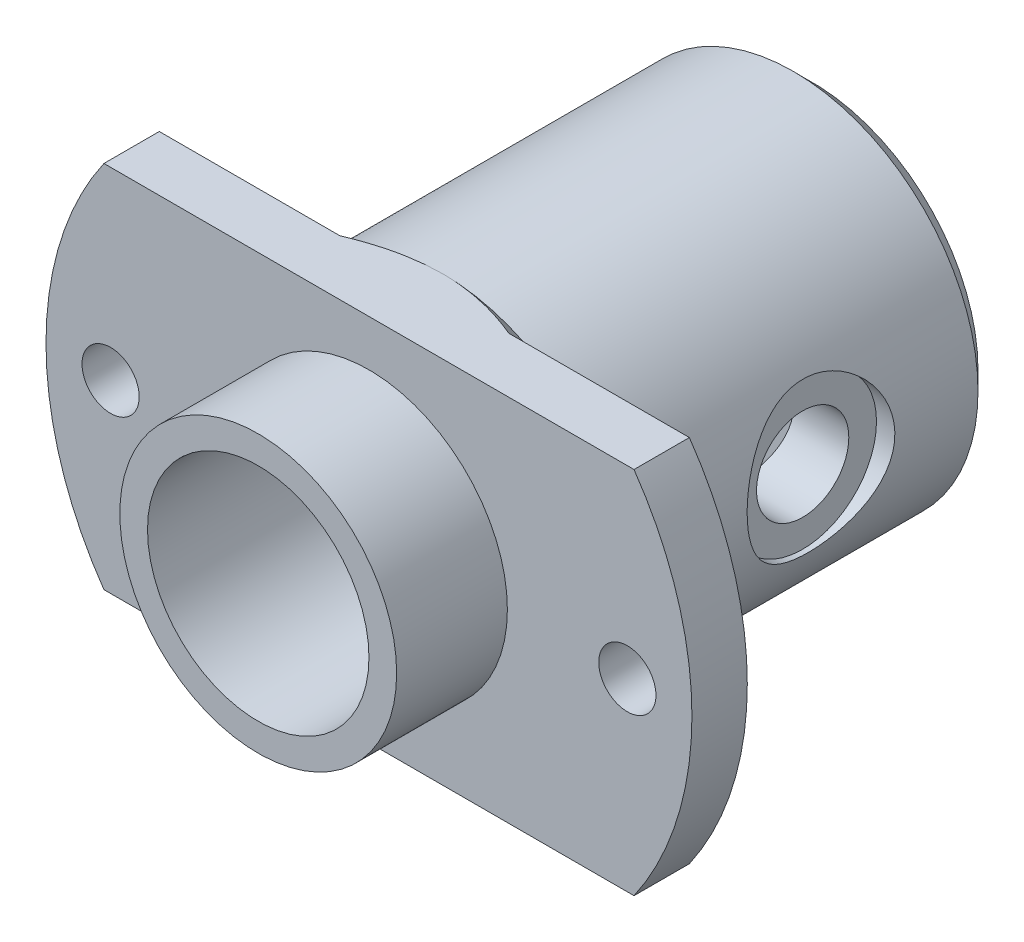
ISO-10303-21;
HEADER;
FILE_DESCRIPTION(('STEP AP214'),'2;1');
FILE_NAME('part.step','',(''),(''),'','','');
FILE_SCHEMA(('AUTOMOTIVE_DESIGN { 1 0 10303 214 1 1 1 1 }'));
ENDSEC;
DATA;
#1=APPLICATION_CONTEXT('core data for automotive mechanical design processes');
#2=APPLICATION_PROTOCOL_DEFINITION('international standard','automotive_design',2000,#1);
#3=PRODUCT_CONTEXT('',#1,'mechanical');
#4=PRODUCT('Part','Part','',(#3));
#5=PRODUCT_RELATED_PRODUCT_CATEGORY('part','',(#4));
#6=PRODUCT_DEFINITION_FORMATION('','',#4);
#7=PRODUCT_DEFINITION_CONTEXT('part definition',#1,'design');
#8=PRODUCT_DEFINITION('design','',#6,#7);
#9=PRODUCT_DEFINITION_SHAPE('','',#8);
#10=(LENGTH_UNIT() NAMED_UNIT(*) SI_UNIT(.MILLI.,.METRE.));
#11=(NAMED_UNIT(*) PLANE_ANGLE_UNIT() SI_UNIT($,.RADIAN.));
#12=(NAMED_UNIT(*) SI_UNIT($,.STERADIAN.) SOLID_ANGLE_UNIT());
#13=UNCERTAINTY_MEASURE_WITH_UNIT(LENGTH_MEASURE(1.E-05),#10,'distance_accuracy_value','');
#14=(GEOMETRIC_REPRESENTATION_CONTEXT(3) GLOBAL_UNCERTAINTY_ASSIGNED_CONTEXT((#13)) GLOBAL_UNIT_ASSIGNED_CONTEXT((#10,
#11,#12)) REPRESENTATION_CONTEXT('',''));
#15=CARTESIAN_POINT('',(0.,0.,0.));
#16=DIRECTION('',(0.,0.,1.));
#17=DIRECTION('',(1.,0.,0.));
#18=AXIS2_PLACEMENT_3D('',#15,#16,#17);
#19=CARTESIAN_POINT('',(0.,0.,21.));
#20=DIRECTION('',(0.,0.,-1.));
#21=DIRECTION('',(-1.,0.,0.));
#22=AXIS2_PLACEMENT_3D('',#19,#20,#21);
#23=CYLINDRICAL_SURFACE('',#22,10.);
#24=CARTESIAN_POINT('',(0.,0.,20.));
#25=DIRECTION('',(0.,0.,1.));
#26=DIRECTION('',(1.,0.,0.));
#27=AXIS2_PLACEMENT_3D('',#24,#25,#26);
#28=CIRCLE('',#27,10.);
#29=CARTESIAN_POINT('',(0.,-10.,20.));
#30=VERTEX_POINT('',#29);
#31=CARTESIAN_POINT('',(0.,10.,20.));
#32=VERTEX_POINT('',#31);
#33=EDGE_CURVE('E201',#30,#32,#28,.F.);
#34=ORIENTED_EDGE('',*,*,#33,.T.);
#35=CARTESIAN_POINT('',(0.,0.,20.));
#36=DIRECTION('',(0.,0.,1.));
#37=DIRECTION('',(1.,0.,0.));
#38=AXIS2_PLACEMENT_3D('',#35,#36,#37);
#39=CIRCLE('',#38,10.);
#40=EDGE_CURVE('E216',#32,#30,#39,.F.);
#41=ORIENTED_EDGE('',*,*,#40,.T.);
#42=EDGE_LOOP('',(#34,#41));
#43=FACE_BOUND('',#42,.T.);
#44=CARTESIAN_POINT('',(0.,0.,1.00000000000003));
#45=DIRECTION('',(0.,0.,1.));
#46=DIRECTION('',(1.,0.,0.));
#47=AXIS2_PLACEMENT_3D('',#44,#45,#46);
#48=CIRCLE('',#47,10.);
#49=CARTESIAN_POINT('',(10.,0.,1.00000000000003));
#50=VERTEX_POINT('',#49);
#51=EDGE_CURVE('E142',#50,#50,#48,.T.);
#52=ORIENTED_EDGE('',*,*,#51,.T.);
#53=EDGE_LOOP('',(#52));
#54=FACE_BOUND('',#53,.T.);
#55=CARTESIAN_POINT('',(9.99477636682668,0.323180100134394,5.5));
#56=CARTESIAN_POINT('',(9.99822943152492,0.216373389853242,5.50000067644265));
#57=CARTESIAN_POINT('',(9.99996794302001,0.109472210853926,5.50428388169084));
#58=CARTESIAN_POINT('',(10.00003122151,-0.103689885361342,5.5214036087477));
#59=CARTESIAN_POINT('',(9.99835380041015,-0.209950348434641,5.53424560939601));
#60=CARTESIAN_POINT('',(9.99168409520241,-0.421227089727657,5.56841954914972));
#61=CARTESIAN_POINT('',(9.98668499602542,-0.526240357268899,5.5897689066311));
#62=CARTESIAN_POINT('',(9.97356734082182,-0.734047972547804,5.64075933526519));
#63=CARTESIAN_POINT('',(9.96544752782911,-0.836841408534771,5.67040374620272));
#64=CARTESIAN_POINT('',(9.93685519713593,-1.14012198736798,5.77120314603585));
#65=CARTESIAN_POINT('',(9.91211907833092,-1.33636974847858,5.85436524640504));
#66=CARTESIAN_POINT('',(9.85419683225046,-1.71203233045422,6.04995073870993));
#67=CARTESIAN_POINT('',(9.82101348693593,-1.89145266659668,6.16236449734311));
#68=CARTESIAN_POINT('',(9.74843351351194,-2.23611137697937,6.41815677127561));
#69=CARTESIAN_POINT('',(9.70885097322071,-2.40056874271,6.56253583204382));
#70=CARTESIAN_POINT('',(9.62882600601941,-2.70376756096472,6.87603541677002));
#71=CARTESIAN_POINT('',(9.5883832034705,-2.84249751138451,7.04516694679058));
#72=CARTESIAN_POINT('',(9.509426614397,-3.0966690483268,7.41270397403877));
#73=CARTESIAN_POINT('',(9.47108833579258,-3.21073818974107,7.61210108310771));
#74=CARTESIAN_POINT('',(9.40354957934956,-3.40349219244578,8.02875848760717));
#75=CARTESIAN_POINT('',(9.3743459742029,-3.48218916764172,8.24601263734031));
#76=CARTESIAN_POINT('',(9.33002485851373,-3.59923111590665,8.68481658584658));
#77=CARTESIAN_POINT('',(9.31447494979392,-3.63882015279799,8.9059890189086));
#78=CARTESIAN_POINT('',(9.29814219898318,-3.68036578804589,9.35234076291028));
#79=CARTESIAN_POINT('',(9.29735305207994,-3.68233845361278,9.57751832198685));
#80=CARTESIAN_POINT('',(9.31023533283032,-3.64962329281681,10.0111686477182));
#81=CARTESIAN_POINT('',(9.32304707850962,-3.61711503431433,10.21983670488));
#82=CARTESIAN_POINT('',(9.36011536552106,-3.52007216238121,10.6285111854002));
#83=CARTESIAN_POINT('',(9.38437365689467,-3.45553265167268,10.8285162791872));
#84=CARTESIAN_POINT('',(9.44183958483733,-3.29529658243417,11.2180556517555));
#85=CARTESIAN_POINT('',(9.47518576857235,-3.19911245204581,11.4073679507787));
#86=CARTESIAN_POINT('',(9.54679945773576,-2.97859570156614,11.7678076291268));
#87=CARTESIAN_POINT('',(9.58506865573007,-2.85425338926775,11.9389287170612));
#88=CARTESIAN_POINT('',(9.66492910460799,-2.57139550829586,12.2698034318814));
#89=CARTESIAN_POINT('',(9.70657484752481,-2.4111867159879,12.428100202363));
#90=CARTESIAN_POINT('',(9.78588024626436,-2.06588759741755,12.7160367414227));
#91=CARTESIAN_POINT('',(9.82353943722348,-1.88079437513292,12.8456731698916));
#92=CARTESIAN_POINT('',(9.89066533328123,-1.48820149648837,13.0736418485737));
#93=CARTESIAN_POINT('',(9.92004453529025,-1.28049250654316,13.1716412266895));
#94=CARTESIAN_POINT('',(9.96614189771828,-0.850138685527443,13.3309129295359));
#95=CARTESIAN_POINT('',(9.98286631767954,-0.627501298023173,13.3922034087691));
#96=CARTESIAN_POINT('',(10.000523877906,-0.187535902403468,13.4731950864492));
#97=CARTESIAN_POINT('',(10.0023152771503,0.0293531307241002,13.4950988608165));
#98=CARTESIAN_POINT('',(9.99161287576591,0.463431841679819,13.5034269194609));
#99=CARTESIAN_POINT('',(9.97912184936856,0.680621452940047,13.4898580933096));
#100=CARTESIAN_POINT('',(9.94135778822221,1.1011037333368,13.4291697985753));
#101=CARTESIAN_POINT('',(9.91655438380072,1.30461601651316,13.3832587991292));
#102=CARTESIAN_POINT('',(9.85636919259359,1.70062827585373,13.2610636592572));
#103=CARTESIAN_POINT('',(9.82098569011239,1.89312645990739,13.1847745919806));
#104=CARTESIAN_POINT('',(9.74088564513542,2.27019535194263,13.0007003145644));
#105=CARTESIAN_POINT('',(9.69585283168528,2.45414253024157,12.8917790276761));
#106=CARTESIAN_POINT('',(9.60119953604585,2.80168946516443,12.6467811956966));
#107=CARTESIAN_POINT('',(9.55157700936328,2.96528007709155,12.5106925172883));
#108=CARTESIAN_POINT('',(9.44850061371701,3.27949189406042,12.2040261907102));
#109=CARTESIAN_POINT('',(9.39502201551887,3.42840003173468,12.0316995957104));
#110=CARTESIAN_POINT('',(9.29319989457322,3.69552879237624,11.6630958946645));
#111=CARTESIAN_POINT('',(9.24485717406355,3.81374462527513,11.4668150571605));
#112=CARTESIAN_POINT('',(9.18038440160385,3.96529539732755,11.1577944937419));
#113=CARTESIAN_POINT('',(9.16019497703457,4.01159673504954,11.0520829738607));
#114=CARTESIAN_POINT('',(9.12319554921149,4.09504442298388,10.8365513143374));
#115=CARTESIAN_POINT('',(9.10638399528877,4.13219497579716,10.7267330875384));
#116=CARTESIAN_POINT('',(9.07674218205712,4.19690596106786,10.5038486241871));
#117=CARTESIAN_POINT('',(9.06390979880137,4.22447151063286,10.3907841557049));
#118=CARTESIAN_POINT('',(9.04269706906918,4.26969046894524,10.162279665859));
#119=CARTESIAN_POINT('',(9.03431626326325,4.28734490036746,10.0468398908651));
#120=CARTESIAN_POINT('',(9.02285549447111,4.31140791724189,9.82468381127483));
#121=CARTESIAN_POINT('',(9.01937914291908,4.31865839225504,9.71807835226372));
#122=CARTESIAN_POINT('',(9.01652997142349,4.32460386362921,9.50453681841174));
#123=CARTESIAN_POINT('',(9.01715851127632,4.32329602494198,9.39760064574421));
#124=CARTESIAN_POINT('',(9.0225025155208,4.31213274472904,9.18432830621134));
#125=CARTESIAN_POINT('',(9.02721591000178,4.30228163231859,9.07799186291013));
#126=CARTESIAN_POINT('',(9.04056106661487,4.27416489986605,8.86667369572987));
#127=CARTESIAN_POINT('',(9.04919431301153,4.25589609239777,8.76169250051984));
#128=CARTESIAN_POINT('',(9.07961959058917,4.19080058044263,8.45955492164862));
#129=CARTESIAN_POINT('',(9.10624581383151,4.13309828898597,8.26510697017706));
#130=CARTESIAN_POINT('',(9.16990748946452,3.98984578332463,7.88872127396211));
#131=CARTESIAN_POINT('',(9.20694591373389,3.90428761731632,7.70678711942076));
#132=CARTESIAN_POINT('',(9.29050526898561,3.7012594402771,7.34734289296009));
#133=CARTESIAN_POINT('',(9.33749139363521,3.58205285065918,7.17092158205706));
#134=CARTESIAN_POINT('',(9.43463441347526,3.31775096263802,6.83964528346627));
#135=CARTESIAN_POINT('',(9.48479245617352,3.17264626005327,6.68479816634058));
#136=CARTESIAN_POINT('',(9.58777905854562,2.84708668314068,6.38838564671407));
#137=CARTESIAN_POINT('',(9.64050245013027,2.66473749885821,6.24885811839873));
#138=CARTESIAN_POINT('',(9.73929366419491,2.27727650634153,6.00226358332478));
#139=CARTESIAN_POINT('',(9.78535785843242,2.07215239606045,5.89521423756513));
#140=CARTESIAN_POINT('',(9.84577476536922,1.75282724234655,5.76244971844543));
#141=CARTESIAN_POINT('',(9.86440004950545,1.64497632912145,5.72295057358134));
#142=CARTESIAN_POINT('',(9.89844735236188,1.42583180645023,5.6532674101066));
#143=CARTESIAN_POINT('',(9.91387088399188,1.31453985167893,5.62307898865086));
#144=CARTESIAN_POINT('',(9.94110042729811,1.08964697828431,5.57243220101636));
#145=CARTESIAN_POINT('',(9.95291567898733,0.976052765315393,5.55194890659546));
#146=CARTESIAN_POINT('',(9.97270210288927,0.747245246868994,5.52086969187125));
#147=CARTESIAN_POINT('',(9.98067621691318,0.632033250227157,5.51026619909269));
#148=CARTESIAN_POINT('',(9.98831613126288,0.484338253824027,5.50311765137361));
#149=CARTESIAN_POINT('',(9.9898258671849,0.45212797837303,5.50194901367112));
#150=CARTESIAN_POINT('',(9.99253464026273,0.387674707018619,5.50039007797897));
#151=CARTESIAN_POINT('',(9.99373367113083,0.355431710466283,5.49999979573975));
#152=CARTESIAN_POINT('',(9.99477636682668,0.323180100134394,5.5));
#153=B_SPLINE_CURVE_WITH_KNOTS('',3,(#55,#56,#57,#58,#59,#60,#61,#62,#63,#64,#65,#66,#67,#68,
#69,#70,#71,#72,#73,#74,#75,#76,#77,#78,#79,#80,#81,#82,#83,#84,#85,#86,#87,#88,#89,#90,#91,#92,
#93,#94,#95,#96,#97,#98,#99,#100,#101,#102,#103,#104,#105,#106,#107,#108,#109,#110,#111,#112,
#113,#114,#115,#116,#117,#118,#119,#120,#121,#122,#123,#124,#125,#126,#127,#128,#129,#130,#131,
#132,#133,#134,#135,#136,#137,#138,#139,#140,#141,#142,#143,#144,#145,#146,#147,#148,#149,#150,
#151,#152),.UNSPECIFIED.,.T.,.F.,(4,2,2,2,2,2,2,2,2,2,2,2,2,2,2,2,2,2,2,2,2,2,2,2,2,2,2,2,2,2,2,
2,2,2,2,2,2,2,2,2,2,2,2,2,2,2,2,2,4),(0.,0.32055469343245,0.641314784556277,0.962735017937068,
1.28428484937925,1.92480067086977,2.56510582085879,3.22934996549342,3.89389036542639,
4.58914011317024,5.28415157697985,5.95626425394612,6.62808984267467,7.25984493589443,
7.89169664830848,8.53377925940786,9.17608321584314,9.86004102344419,10.5440784983079,
11.2350948097491,11.9257690940845,12.5764527891199,13.2270101162292,13.8544666035968,
14.4820248961345,15.1346433557981,15.7875539382325,16.4862340260526,17.1850230896049,
17.5361072338939,17.8870298369393,18.2377648056469,18.5884635772487,18.9087747112552,
19.2291919576932,19.5494469345753,19.8698232782967,20.4806134562331,21.0915781448727,
21.7429580701294,22.3945750089649,23.0980523002054,23.8019114457924,24.1505973802891,
24.4991181748412,24.8467388521854,25.194092872396,25.2908863775839,25.3876818414216),.UNSPECIFIED.);
#154=CARTESIAN_POINT('',(9.99477636682668,0.323180100134394,5.5));
#155=VERTEX_POINT('',#154);
#156=EDGE_CURVE('E129',#155,#155,#153,.T.);
#157=ORIENTED_EDGE('',*,*,#156,.T.);
#158=EDGE_LOOP('',(#157));
#159=FACE_BOUND('',#158,.T.);
#160=ADVANCED_FACE('F35',(#43,#54,#159),#23,.T.);
#161=CARTESIAN_POINT('',(0.,0.,0.));
#162=DIRECTION('',(0.,0.,1.));
#163=DIRECTION('',(1.,0.,0.));
#164=AXIS2_PLACEMENT_3D('',#161,#162,#163);
#165=PLANE('',#164);
#166=CARTESIAN_POINT('',(0.,0.,0.));
#167=DIRECTION('',(0.,0.,1.));
#168=DIRECTION('',(1.,0.,0.));
#169=AXIS2_PLACEMENT_3D('',#166,#167,#168);
#170=CIRCLE('',#169,8.99999999999996);
#171=CARTESIAN_POINT('',(8.99999999999996,0.,0.));
#172=VERTEX_POINT('',#171);
#173=EDGE_CURVE('E208',#172,#172,#170,.F.);
#174=ORIENTED_EDGE('',*,*,#173,.T.);
#175=EDGE_LOOP('',(#174));
#176=FACE_BOUND('',#175,.T.);
#177=ADVANCED_FACE('F191',(#176),#165,.F.);
#178=CARTESIAN_POINT('',(0.,0.,21.));
#179=DIRECTION('',(0.,0.,1.));
#180=DIRECTION('',(1.,0.,0.));
#181=AXIS2_PLACEMENT_3D('',#178,#179,#180);
#182=PLANE('',#181);
#183=CARTESIAN_POINT('',(-14.,0.,21.));
#184=DIRECTION('',(0.,0.,1.));
#185=DIRECTION('',(1.,0.,0.));
#186=AXIS2_PLACEMENT_3D('',#183,#184,#185);
#187=CIRCLE('',#186,1.55);
#188=CARTESIAN_POINT('',(-12.45,0.,21.));
#189=VERTEX_POINT('',#188);
#190=EDGE_CURVE('E289',#189,#189,#187,.T.);
#191=ORIENTED_EDGE('',*,*,#190,.T.);
#192=EDGE_LOOP('',(#191));
#193=FACE_BOUND('',#192,.T.);
#194=DIRECTION('',(-1.,0.,0.));
#195=VECTOR('',#194,1.);
#196=CARTESIAN_POINT('',(14.3614066163451,10.,21.));
#197=LINE('',#196,#195);
#198=CARTESIAN_POINT('',(-4.5825756949558,10.,21.));
#199=VERTEX_POINT('',#198);
#200=CARTESIAN_POINT('',(-14.3614066163451,10.,21.));
#201=VERTEX_POINT('',#200);
#202=EDGE_CURVE('E290',#199,#201,#197,.T.);
#203=ORIENTED_EDGE('',*,*,#202,.F.);
#204=CARTESIAN_POINT('',(0.,0.,21.));
#205=DIRECTION('',(0.,0.,1.));
#206=DIRECTION('',(1.,0.,0.));
#207=AXIS2_PLACEMENT_3D('',#204,#205,#206);
#208=CIRCLE('',#207,11.);
#209=CARTESIAN_POINT('',(-4.5825756949558,-10.,21.));
#210=VERTEX_POINT('',#209);
#211=EDGE_CURVE('E57',#199,#210,#208,.T.);
#212=ORIENTED_EDGE('',*,*,#211,.T.);
#213=DIRECTION('',(1.,0.,0.));
#214=VECTOR('',#213,1.);
#215=CARTESIAN_POINT('',(-14.3614066163451,-10.,21.));
#216=LINE('',#215,#214);
#217=CARTESIAN_POINT('',(-14.3614066163451,-10.,21.));
#218=VERTEX_POINT('',#217);
#219=EDGE_CURVE('E257',#218,#210,#216,.T.);
#220=ORIENTED_EDGE('',*,*,#219,.F.);
#221=CARTESIAN_POINT('',(0.,0.,21.));
#222=DIRECTION('',(0.,0.,1.));
#223=DIRECTION('',(1.,0.,0.));
#224=AXIS2_PLACEMENT_3D('',#221,#222,#223);
#225=CIRCLE('',#224,17.5);
#226=EDGE_CURVE('E125',#201,#218,#225,.T.);
#227=ORIENTED_EDGE('',*,*,#226,.F.);
#228=EDGE_LOOP('',(#203,#212,#220,#227));
#229=FACE_BOUND('',#228,.T.);
#230=ADVANCED_FACE('F196',(#193,#229),#182,.F.);
#231=CARTESIAN_POINT('',(14.,0.,21.));
#232=DIRECTION('',(0.,0.,1.));
#233=DIRECTION('',(1.,0.,0.));
#234=AXIS2_PLACEMENT_3D('',#231,#232,#233);
#235=CIRCLE('',#234,1.55);
#236=CARTESIAN_POINT('',(15.55,0.,21.));
#237=VERTEX_POINT('',#236);
#238=EDGE_CURVE('E310',#237,#237,#235,.T.);
#239=ORIENTED_EDGE('',*,*,#238,.T.);
#240=EDGE_LOOP('',(#239));
#241=FACE_BOUND('',#240,.T.);
#242=CARTESIAN_POINT('',(4.58257569495579,-10.,21.));
#243=VERTEX_POINT('',#242);
#244=CARTESIAN_POINT('',(14.3614066163451,-10.,21.));
#245=VERTEX_POINT('',#244);
#246=EDGE_CURVE('E304',#243,#245,#216,.T.);
#247=ORIENTED_EDGE('',*,*,#246,.F.);
#248=CARTESIAN_POINT('',(0.,0.,21.));
#249=DIRECTION('',(0.,0.,1.));
#250=DIRECTION('',(1.,0.,0.));
#251=AXIS2_PLACEMENT_3D('',#248,#249,#250);
#252=CIRCLE('',#251,11.);
#253=CARTESIAN_POINT('',(4.5825756949558,10.,21.));
#254=VERTEX_POINT('',#253);
#255=EDGE_CURVE('E210',#243,#254,#252,.T.);
#256=ORIENTED_EDGE('',*,*,#255,.T.);
#257=CARTESIAN_POINT('',(14.3614066163451,10.,21.));
#258=VERTEX_POINT('',#257);
#259=EDGE_CURVE('E121',#258,#254,#197,.T.);
#260=ORIENTED_EDGE('',*,*,#259,.F.);
#261=CARTESIAN_POINT('',(0.,0.,21.));
#262=DIRECTION('',(0.,0.,1.));
#263=DIRECTION('',(1.,0.,0.));
#264=AXIS2_PLACEMENT_3D('',#261,#262,#263);
#265=CIRCLE('',#264,17.5);
#266=EDGE_CURVE('E291',#245,#258,#265,.T.);
#267=ORIENTED_EDGE('',*,*,#266,.F.);
#268=EDGE_LOOP('',(#247,#256,#260,#267));
#269=FACE_BOUND('',#268,.T.);
#270=ADVANCED_FACE('F271',(#241,#269),#182,.F.);
#271=CARTESIAN_POINT('',(0.,0.,24.));
#272=DIRECTION('',(0.,0.,1.));
#273=DIRECTION('',(1.,0.,0.));
#274=AXIS2_PLACEMENT_3D('',#271,#272,#273);
#275=PLANE('',#274);
#276=CARTESIAN_POINT('',(0.,0.,24.));
#277=DIRECTION('',(0.,0.,1.));
#278=DIRECTION('',(1.,0.,0.));
#279=AXIS2_PLACEMENT_3D('',#276,#277,#278);
#280=CIRCLE('',#279,7.5);
#281=CARTESIAN_POINT('',(7.5,0.,24.));
#282=VERTEX_POINT('',#281);
#283=EDGE_CURVE('E126',#282,#282,#280,.T.);
#284=ORIENTED_EDGE('',*,*,#283,.F.);
#285=EDGE_LOOP('',(#284));
#286=FACE_BOUND('',#285,.T.);
#287=CARTESIAN_POINT('',(14.,0.,24.));
#288=DIRECTION('',(0.,0.,1.));
#289=DIRECTION('',(1.,0.,0.));
#290=AXIS2_PLACEMENT_3D('',#287,#288,#289);
#291=CIRCLE('',#290,1.55);
#292=CARTESIAN_POINT('',(15.55,0.,24.));
#293=VERTEX_POINT('',#292);
#294=EDGE_CURVE('E305',#293,#293,#291,.T.);
#295=ORIENTED_EDGE('',*,*,#294,.F.);
#296=EDGE_LOOP('',(#295));
#297=FACE_BOUND('',#296,.T.);
#298=CARTESIAN_POINT('',(0.,0.,24.));
#299=DIRECTION('',(0.,0.,1.));
#300=DIRECTION('',(1.,0.,0.));
#301=AXIS2_PLACEMENT_3D('',#298,#299,#300);
#302=CIRCLE('',#301,17.5);
#303=CARTESIAN_POINT('',(-14.3614066163451,10.,24.));
#304=VERTEX_POINT('',#303);
#305=CARTESIAN_POINT('',(-14.3614066163451,-10.,24.));
#306=VERTEX_POINT('',#305);
#307=EDGE_CURVE('E111',#304,#306,#302,.T.);
#308=ORIENTED_EDGE('',*,*,#307,.T.);
#309=DIRECTION('',(1.,0.,0.));
#310=VECTOR('',#309,1.);
#311=CARTESIAN_POINT('',(-14.3614066163451,-10.,24.));
#312=LINE('',#311,#310);
#313=CARTESIAN_POINT('',(14.3614066163451,-10.,24.));
#314=VERTEX_POINT('',#313);
#315=EDGE_CURVE('E100',#306,#314,#312,.T.);
#316=ORIENTED_EDGE('',*,*,#315,.T.);
#317=CARTESIAN_POINT('',(0.,0.,24.));
#318=DIRECTION('',(0.,0.,1.));
#319=DIRECTION('',(1.,0.,0.));
#320=AXIS2_PLACEMENT_3D('',#317,#318,#319);
#321=CIRCLE('',#320,17.5);
#322=CARTESIAN_POINT('',(14.3614066163451,10.,24.));
#323=VERTEX_POINT('',#322);
#324=EDGE_CURVE('E110',#314,#323,#321,.T.);
#325=ORIENTED_EDGE('',*,*,#324,.T.);
#326=DIRECTION('',(-1.,0.,0.));
#327=VECTOR('',#326,1.);
#328=CARTESIAN_POINT('',(14.3614066163451,10.,24.));
#329=LINE('',#328,#327);
#330=EDGE_CURVE('E117',#323,#304,#329,.T.);
#331=ORIENTED_EDGE('',*,*,#330,.T.);
#332=EDGE_LOOP('',(#308,#316,#325,#331));
#333=FACE_BOUND('',#332,.T.);
#334=CARTESIAN_POINT('',(-14.,0.,24.));
#335=DIRECTION('',(0.,0.,1.));
#336=DIRECTION('',(1.,0.,0.));
#337=AXIS2_PLACEMENT_3D('',#334,#335,#336);
#338=CIRCLE('',#337,1.55);
#339=CARTESIAN_POINT('',(-12.45,0.,24.));
#340=VERTEX_POINT('',#339);
#341=EDGE_CURVE('E313',#340,#340,#338,.T.);
#342=ORIENTED_EDGE('',*,*,#341,.F.);
#343=EDGE_LOOP('',(#342));
#344=FACE_BOUND('',#343,.T.);
#345=ADVANCED_FACE('F114',(#286,#297,#333,#344),#275,.T.);
#346=CARTESIAN_POINT('',(0.,0.,24.));
#347=DIRECTION('',(0.,0.,-1.));
#348=DIRECTION('',(-1.,0.,0.));
#349=AXIS2_PLACEMENT_3D('',#346,#347,#348);
#350=CYLINDRICAL_SURFACE('',#349,17.5);
#351=ORIENTED_EDGE('',*,*,#226,.T.);
#352=DIRECTION('',(0.,0.,-1.));
#353=VECTOR('',#352,1.);
#354=CARTESIAN_POINT('',(-14.3614066163451,-10.,24.));
#355=LINE('',#354,#353);
#356=EDGE_CURVE('E104',#306,#218,#355,.T.);
#357=ORIENTED_EDGE('',*,*,#356,.F.);
#358=ORIENTED_EDGE('',*,*,#307,.F.);
#359=DIRECTION('',(0.,0.,-1.));
#360=VECTOR('',#359,1.);
#361=CARTESIAN_POINT('',(-14.3614066163451,10.,24.));
#362=LINE('',#361,#360);
#363=EDGE_CURVE('E297',#304,#201,#362,.T.);
#364=ORIENTED_EDGE('',*,*,#363,.T.);
#365=EDGE_LOOP('',(#351,#357,#358,#364));
#366=FACE_BOUND('',#365,.T.);
#367=ADVANCED_FACE('F123',(#366),#350,.T.);
#368=CARTESIAN_POINT('',(-14.3614066163451,-10.,24.));
#369=DIRECTION('',(0.,1.,0.));
#370=DIRECTION('',(-1.,0.,0.));
#371=AXIS2_PLACEMENT_3D('',#368,#369,#370);
#372=PLANE('',#371);
#373=ORIENTED_EDGE('',*,*,#219,.T.);
#374=CARTESIAN_POINT('',(-4.5825756949558,-10.,21.));
#375=CARTESIAN_POINT('',(-4.40028329745402,-10.,20.9240699999568));
#376=CARTESIAN_POINT('',(-4.21668434662434,-10.,20.8513181801491));
#377=CARTESIAN_POINT('',(-3.84668711964437,-10.,20.7129568891509));
#378=CARTESIAN_POINT('',(-3.66028713858135,-10.,20.6473519865579));
#379=CARTESIAN_POINT('',(-3.10086162076162,-10.,20.463858720974));
#380=CARTESIAN_POINT('',(-2.72381902600777,-10.,20.3576786437169));
#381=CARTESIAN_POINT('',(-2.15145029539176,-10.,20.2271237041539));
#382=CARTESIAN_POINT('',(-1.95932775328548,-10.,20.1883665036465));
#383=CARTESIAN_POINT('',(-1.57326186543209,-10.,20.1212171802021));
#384=CARTESIAN_POINT('',(-1.37931860628588,-10.,20.0928245668184));
#385=CARTESIAN_POINT('',(-0.988206780234207,-10.,20.0468172913418));
#386=CARTESIAN_POINT('',(-0.791025283499132,-10.,20.0293119718433));
#387=CARTESIAN_POINT('',(-0.395902718657349,-10.,20.005877018507));
#388=CARTESIAN_POINT('',(-0.197961387964163,-10.,19.9999518320596));
#389=CARTESIAN_POINT('',(0.,-10.,20.));
#390=B_SPLINE_CURVE_WITH_KNOTS('',3,(#374,#375,#376,#377,#378,#379,#380,#381,#382,#383,#384,
#385,#386,#387,#388,#389),.UNSPECIFIED.,.F.,.F.,(4,2,2,2,2,2,2,4),(0.,0.592342369633569,
1.18506119357525,2.35817128719334,2.94592281647589,3.5336465300736,4.12718135483271,
4.72094408395054),.UNSPECIFIED.);
#391=EDGE_CURVE('E50',#210,#30,#390,.T.);
#392=ORIENTED_EDGE('',*,*,#391,.T.);
#393=CARTESIAN_POINT('',(0.,-10.,20.));
#394=CARTESIAN_POINT('',(0.153419663015411,-10.,19.9999822375841));
#395=CARTESIAN_POINT('',(0.306833269140143,-10.,20.0035301672553));
#396=CARTESIAN_POINT('',(0.613315443693142,-10.,20.0176254842963));
#397=CARTESIAN_POINT('',(0.766384062318444,-10.,20.0281717771992));
#398=CARTESIAN_POINT('',(1.07166096213252,-10.,20.0561108711518));
#399=CARTESIAN_POINT('',(1.22387019312161,-10.,20.073493315066));
#400=CARTESIAN_POINT('',(1.52738320749773,-10.,20.1148546924769));
#401=CARTESIAN_POINT('',(1.67868696596961,-10.,20.1388338066437));
#402=CARTESIAN_POINT('',(2.12685071573971,-10.,20.2194912676538));
#403=CARTESIAN_POINT('',(2.42210425955918,-10.,20.2852852762263));
#404=CARTESIAN_POINT('',(3.00688490566497,-10.,20.4384673595879));
#405=CARTESIAN_POINT('',(3.29641147680476,-10.,20.52585742725));
#406=CARTESIAN_POINT('',(3.75125759759246,-10.,20.6792679407483));
#407=CARTESIAN_POINT('',(3.91864293763951,-10.,20.739275515868));
#408=CARTESIAN_POINT('',(4.25191342087296,-10.,20.8653071232564));
#409=CARTESIAN_POINT('',(4.41778971858559,-10.,20.9313545846164));
#410=CARTESIAN_POINT('',(4.5825756949558,-10.,21.));
#411=B_SPLINE_CURVE_WITH_KNOTS('',3,(#393,#394,#395,#396,#397,#398,#399,#400,#401,#402,#403,
#404,#405,#406,#407,#408,#409,#410),.UNSPECIFIED.,.F.,.F.,(4,2,2,2,2,2,2,2,4),(0.,
0.460207930915165,0.920343907336796,1.379785422175,1.83923952149438,2.74570852905121,
3.65226121634112,4.18561484858958,4.72113306860306),.UNSPECIFIED.);
#412=EDGE_CURVE('E225',#30,#243,#411,.T.);
#413=ORIENTED_EDGE('',*,*,#412,.T.);
#414=ORIENTED_EDGE('',*,*,#246,.T.);
#415=DIRECTION('',(0.,0.,-1.));
#416=VECTOR('',#415,1.);
#417=CARTESIAN_POINT('',(14.3614066163451,-10.,24.));
#418=LINE('',#417,#416);
#419=EDGE_CURVE('E107',#314,#245,#418,.T.);
#420=ORIENTED_EDGE('',*,*,#419,.F.);
#421=ORIENTED_EDGE('',*,*,#315,.F.);
#422=ORIENTED_EDGE('',*,*,#356,.T.);
#423=EDGE_LOOP('',(#373,#392,#413,#414,#420,#421,#422));
#424=FACE_BOUND('',#423,.T.);
#425=ADVANCED_FACE('F102',(#424),#372,.F.);
#426=CARTESIAN_POINT('',(0.,0.,24.));
#427=DIRECTION('',(0.,0.,-1.));
#428=DIRECTION('',(-1.,0.,0.));
#429=AXIS2_PLACEMENT_3D('',#426,#427,#428);
#430=CYLINDRICAL_SURFACE('',#429,17.5);
#431=ORIENTED_EDGE('',*,*,#266,.T.);
#432=DIRECTION('',(0.,0.,-1.));
#433=VECTOR('',#432,1.);
#434=CARTESIAN_POINT('',(14.3614066163451,10.,24.));
#435=LINE('',#434,#433);
#436=EDGE_CURVE('E131',#323,#258,#435,.T.);
#437=ORIENTED_EDGE('',*,*,#436,.F.);
#438=ORIENTED_EDGE('',*,*,#324,.F.);
#439=ORIENTED_EDGE('',*,*,#419,.T.);
#440=EDGE_LOOP('',(#431,#437,#438,#439));
#441=FACE_BOUND('',#440,.T.);
#442=ADVANCED_FACE('F265',(#441),#430,.T.);
#443=CARTESIAN_POINT('',(14.3614066163451,10.,24.));
#444=DIRECTION('',(0.,-1.,0.));
#445=DIRECTION('',(0.,0.,-1.));
#446=AXIS2_PLACEMENT_3D('',#443,#444,#445);
#447=PLANE('',#446);
#448=ORIENTED_EDGE('',*,*,#259,.T.);
#449=CARTESIAN_POINT('',(4.5825756949558,10.,21.));
#450=CARTESIAN_POINT('',(4.40028329745402,10.,20.9240699999568));
#451=CARTESIAN_POINT('',(4.21668434662435,10.,20.8513181801491));
#452=CARTESIAN_POINT('',(3.84668711964437,10.,20.7129568891509));
#453=CARTESIAN_POINT('',(3.66028713858135,10.,20.6473519865579));
#454=CARTESIAN_POINT('',(3.10086162076162,10.,20.463858720974));
#455=CARTESIAN_POINT('',(2.72381902600777,10.,20.3576786437169));
#456=CARTESIAN_POINT('',(2.15145029539176,10.,20.2271237041539));
#457=CARTESIAN_POINT('',(1.95932775328548,10.,20.1883665036465));
#458=CARTESIAN_POINT('',(1.57326186543209,10.,20.1212171802021));
#459=CARTESIAN_POINT('',(1.37931860628588,10.,20.0928245668184));
#460=CARTESIAN_POINT('',(0.988206780234209,10.,20.0468172913418));
#461=CARTESIAN_POINT('',(0.791025283499133,10.,20.0293119718433));
#462=CARTESIAN_POINT('',(0.395902718657349,10.,20.005877018507));
#463=CARTESIAN_POINT('',(0.197961387964163,10.,19.9999518320596));
#464=CARTESIAN_POINT('',(0.,10.,20.));
#465=B_SPLINE_CURVE_WITH_KNOTS('',3,(#449,#450,#451,#452,#453,#454,#455,#456,#457,#458,#459,
#460,#461,#462,#463,#464),.UNSPECIFIED.,.F.,.F.,(4,2,2,2,2,2,2,4),(0.,0.59234236963357,
1.18506119357525,2.35817128719334,2.94592281647589,3.5336465300736,4.12718135483271,
4.72094408395054),.UNSPECIFIED.);
#466=EDGE_CURVE('E219',#254,#32,#465,.T.);
#467=ORIENTED_EDGE('',*,*,#466,.T.);
#468=CARTESIAN_POINT('',(0.,10.,20.));
#469=CARTESIAN_POINT('',(-0.153419663015412,10.,19.9999822375841));
#470=CARTESIAN_POINT('',(-0.306833269140144,10.,20.0035301672553));
#471=CARTESIAN_POINT('',(-0.613315443693144,10.,20.0176254842963));
#472=CARTESIAN_POINT('',(-0.766384062318446,10.,20.0281717771992));
#473=CARTESIAN_POINT('',(-1.07166096213252,10.,20.0561108711518));
#474=CARTESIAN_POINT('',(-1.22387019312161,10.,20.073493315066));
#475=CARTESIAN_POINT('',(-1.52738320749773,10.,20.1148546924769));
#476=CARTESIAN_POINT('',(-1.67868696596962,10.,20.1388338066437));
#477=CARTESIAN_POINT('',(-2.12685071573971,10.,20.2194912676538));
#478=CARTESIAN_POINT('',(-2.42210425955918,10.,20.2852852762263));
#479=CARTESIAN_POINT('',(-3.00688490566498,10.,20.4384673595879));
#480=CARTESIAN_POINT('',(-3.29641147680476,10.,20.52585742725));
#481=CARTESIAN_POINT('',(-3.75125759759246,10.,20.6792679407483));
#482=CARTESIAN_POINT('',(-3.91864293763952,10.,20.739275515868));
#483=CARTESIAN_POINT('',(-4.25191342087296,10.,20.8653071232564));
#484=CARTESIAN_POINT('',(-4.4177897185856,10.,20.9313545846164));
#485=CARTESIAN_POINT('',(-4.5825756949558,10.,21.));
#486=B_SPLINE_CURVE_WITH_KNOTS('',3,(#468,#469,#470,#471,#472,#473,#474,#475,#476,#477,#478,
#479,#480,#481,#482,#483,#484,#485),.UNSPECIFIED.,.F.,.F.,(4,2,2,2,2,2,2,2,4),(0.,
0.460207930915165,0.920343907336797,1.379785422175,1.83923952149438,2.74570852905121,
3.65226121634112,4.18561484858958,4.72113306860306),.UNSPECIFIED.);
#487=EDGE_CURVE('E11',#32,#199,#486,.T.);
#488=ORIENTED_EDGE('',*,*,#487,.T.);
#489=ORIENTED_EDGE('',*,*,#202,.T.);
#490=ORIENTED_EDGE('',*,*,#363,.F.);
#491=ORIENTED_EDGE('',*,*,#330,.F.);
#492=ORIENTED_EDGE('',*,*,#436,.T.);
#493=EDGE_LOOP('',(#448,#467,#488,#489,#490,#491,#492));
#494=FACE_BOUND('',#493,.T.);
#495=ADVANCED_FACE('F231',(#494),#447,.F.);
#496=CARTESIAN_POINT('',(14.,0.,24.));
#497=DIRECTION('',(0.,0.,-1.));
#498=DIRECTION('',(-1.,0.,0.));
#499=AXIS2_PLACEMENT_3D('',#496,#497,#498);
#500=CYLINDRICAL_SURFACE('',#499,1.55);
#501=ORIENTED_EDGE('',*,*,#294,.T.);
#502=EDGE_LOOP('',(#501));
#503=FACE_BOUND('',#502,.T.);
#504=ORIENTED_EDGE('',*,*,#238,.F.);
#505=EDGE_LOOP('',(#504));
#506=FACE_BOUND('',#505,.T.);
#507=ADVANCED_FACE('F281',(#503,#506),#500,.F.);
#508=CARTESIAN_POINT('',(-14.,0.,24.));
#509=DIRECTION('',(0.,0.,-1.));
#510=DIRECTION('',(-1.,0.,0.));
#511=AXIS2_PLACEMENT_3D('',#508,#509,#510);
#512=CYLINDRICAL_SURFACE('',#511,1.55);
#513=ORIENTED_EDGE('',*,*,#341,.T.);
#514=EDGE_LOOP('',(#513));
#515=FACE_BOUND('',#514,.T.);
#516=ORIENTED_EDGE('',*,*,#190,.F.);
#517=EDGE_LOOP('',(#516));
#518=FACE_BOUND('',#517,.T.);
#519=ADVANCED_FACE('F338',(#515,#518),#512,.F.);
#520=CARTESIAN_POINT('',(0.,0.,30.));
#521=DIRECTION('',(0.,0.,-1.));
#522=DIRECTION('',(-1.,0.,0.));
#523=AXIS2_PLACEMENT_3D('',#520,#521,#522);
#524=CYLINDRICAL_SURFACE('',#523,7.5);
#525=CARTESIAN_POINT('',(0.,0.,30.));
#526=DIRECTION('',(0.,0.,1.));
#527=DIRECTION('',(1.,0.,0.));
#528=AXIS2_PLACEMENT_3D('',#525,#526,#527);
#529=CIRCLE('',#528,7.5);
#530=CARTESIAN_POINT('',(7.5,0.,30.));
#531=VERTEX_POINT('',#530);
#532=EDGE_CURVE('E317',#531,#531,#529,.T.);
#533=ORIENTED_EDGE('',*,*,#532,.F.);
#534=EDGE_LOOP('',(#533));
#535=FACE_BOUND('',#534,.T.);
#536=ORIENTED_EDGE('',*,*,#283,.T.);
#537=EDGE_LOOP('',(#536));
#538=FACE_BOUND('',#537,.T.);
#539=ADVANCED_FACE('F333',(#535,#538),#524,.T.);
#540=CARTESIAN_POINT('',(0.,0.,30.));
#541=DIRECTION('',(0.,0.,1.));
#542=DIRECTION('',(1.,0.,0.));
#543=AXIS2_PLACEMENT_3D('',#540,#541,#542);
#544=PLANE('',#543);
#545=CARTESIAN_POINT('',(0.,0.,30.));
#546=DIRECTION('',(0.,0.,1.));
#547=DIRECTION('',(1.,0.,0.));
#548=AXIS2_PLACEMENT_3D('',#545,#546,#547);
#549=CIRCLE('',#548,6.);
#550=CARTESIAN_POINT('',(6.,0.,30.));
#551=VERTEX_POINT('',#550);
#552=EDGE_CURVE('E323',#551,#551,#549,.T.);
#553=ORIENTED_EDGE('',*,*,#552,.F.);
#554=EDGE_LOOP('',(#553));
#555=FACE_BOUND('',#554,.T.);
#556=ORIENTED_EDGE('',*,*,#532,.T.);
#557=EDGE_LOOP('',(#556));
#558=FACE_BOUND('',#557,.T.);
#559=ADVANCED_FACE('F163',(#555,#558),#544,.T.);
#560=CARTESIAN_POINT('',(0.,0.,5.));
#561=DIRECTION('',(0.,0.,1.));
#562=DIRECTION('',(1.,0.,0.));
#563=AXIS2_PLACEMENT_3D('',#560,#561,#562);
#564=CYLINDRICAL_SURFACE('',#563,6.);
#565=CARTESIAN_POINT('',(6.,0.,7.02097708302704));
#566=CARTESIAN_POINT('',(5.99999598282669,0.131664564125909,7.00381767256645));
#567=CARTESIAN_POINT('',(5.99561758491506,0.264923718736377,6.99716875944614));
#568=CARTESIAN_POINT('',(5.97799661578229,0.530414747901026,7.00505115784827));
#569=CARTESIAN_POINT('',(5.96473268709788,0.66264336890652,7.01963360087017));
#570=CARTESIAN_POINT('',(5.9302141883632,0.921730006696426,7.06914135063743));
#571=CARTESIAN_POINT('',(5.90898338540737,1.04860276112925,7.10400631832875));
#572=CARTESIAN_POINT('',(5.86010397534799,1.29416967384965,7.19257093633159));
#573=CARTESIAN_POINT('',(5.83245719403645,1.41286614641984,7.24626523060774));
#574=CARTESIAN_POINT('',(5.77155237598377,1.64441797052608,7.37338373537834));
#575=CARTESIAN_POINT('',(5.73810823906689,1.75682246291975,7.44753817121281));
#576=CARTESIAN_POINT('',(5.66916031977245,1.96798948569001,7.61252085785243));
#577=CARTESIAN_POINT('',(5.63365529711999,2.06674367765238,7.70335922199326));
#578=CARTESIAN_POINT('',(5.56093697661283,2.25542667249757,7.90716911804588));
#579=CARTESIAN_POINT('',(5.52379305814104,2.34415260822104,8.0212843946917));
#580=CARTESIAN_POINT('',(5.45448902322065,2.50118768647974,8.26420530522648));
#581=CARTESIAN_POINT('',(5.42232861299906,2.56949803271496,8.39301007240646));
#582=CARTESIAN_POINT('',(5.36753461333267,2.68205906865775,8.6596403823872));
#583=CARTESIAN_POINT('',(5.34472758017197,2.72675268726958,8.79724121228943));
#584=CARTESIAN_POINT('',(5.31105532539529,2.79178793109022,9.07943421414144));
#585=CARTESIAN_POINT('',(5.30017623354051,2.81215784324126,9.2240180611984));
#586=CARTESIAN_POINT('',(5.29251151293295,2.82654526797069,9.49892500885229));
#587=CARTESIAN_POINT('',(5.29431363851042,2.82320310823761,9.62907687502231));
#588=CARTESIAN_POINT('',(5.30847548608997,2.79648218357071,9.88671138928104));
#589=CARTESIAN_POINT('',(5.32083558434061,2.77310270457806,10.0141939420791));
#590=CARTESIAN_POINT('',(5.35399407015958,2.70850427926135,10.2587574157843));
#591=CARTESIAN_POINT('',(5.37450094689108,2.66789863088125,10.3760426731024));
#592=CARTESIAN_POINT('',(5.42178674147914,2.570438141811,10.6022776158888));
#593=CARTESIAN_POINT('',(5.44856760236894,2.51357826603367,10.7112247051569));
#594=CARTESIAN_POINT('',(5.50866396515817,2.37918332805241,10.9285106002052));
#595=CARTESIAN_POINT('',(5.54235454959862,2.30022378149758,11.0358639477376));
#596=CARTESIAN_POINT('',(5.61127241880282,2.12658155102813,11.2364799551293));
#597=CARTESIAN_POINT('',(5.64650054294033,2.03189019760218,11.3297347911329));
#598=CARTESIAN_POINT('',(5.71858043682745,1.81973519601849,11.5077652781823));
#599=CARTESIAN_POINT('',(5.75530601720851,1.7010059570676,11.5910929845879));
#600=CARTESIAN_POINT('',(5.82365786181392,1.4498027479305,11.7364626409343));
#601=CARTESIAN_POINT('',(5.85528490047591,1.31733087020145,11.7985078251792));
#602=CARTESIAN_POINT('',(5.90983279393975,1.04529845568278,11.8977068961246));
#603=CARTESIAN_POINT('',(5.93294105532831,0.905978171659589,11.9354123079476));
#604=CARTESIAN_POINT('',(5.9694181521513,0.621714650719442,11.9863000822261));
#605=CARTESIAN_POINT('',(5.98279323330112,0.476775082671795,11.9994981793115));
#606=CARTESIAN_POINT('',(5.99822682732933,0.197976990662007,12.0004346583002));
#607=CARTESIAN_POINT('',(6.00111096688013,0.0641674516462236,11.9901403740721));
#608=CARTESIAN_POINT('',(5.9981205694572,-0.199970766118935,11.9483027244531));
#609=CARTESIAN_POINT('',(5.99224688857568,-0.330299783827727,11.916761436159));
#610=CARTESIAN_POINT('',(5.97312388216377,-0.58069427712841,11.8345180861239));
#611=CARTESIAN_POINT('',(5.96005302816649,-0.700929991136503,11.7842888485187));
#612=CARTESIAN_POINT('',(5.92838139856489,-0.931591644295498,11.6661827650581));
#613=CARTESIAN_POINT('',(5.90977940992736,-1.04201542468424,11.5983020484667));
#614=CARTESIAN_POINT('',(5.86811928234189,-1.25605622312578,11.4427826345234));
#615=CARTESIAN_POINT('',(5.84488081233041,-1.35902855739859,11.3543055508819));
#616=CARTESIAN_POINT('',(5.79736483415706,-1.54925552816397,11.1620141175952));
#617=CARTESIAN_POINT('',(5.77308690526259,-1.63650372426297,11.0581935149963));
#618=CARTESIAN_POINT('',(5.72512251428507,-1.79732787880303,10.8318035434155));
#619=CARTESIAN_POINT('',(5.70153175123859,-1.8699621103263,10.7085417761875));
#620=CARTESIAN_POINT('',(5.65955964549728,-1.99340459085753,10.4507088536218));
#621=CARTESIAN_POINT('',(5.64117686110523,-2.04421888217688,10.3161408415326));
#622=CARTESIAN_POINT('',(5.61270174104742,-2.12114023515596,10.0430395827559));
#623=CARTESIAN_POINT('',(5.60240733022028,-2.14785217642103,9.90469883443448));
#624=CARTESIAN_POINT('',(5.59090155202326,-2.17763464597344,9.62514755788218));
#625=CARTESIAN_POINT('',(5.58968616285584,-2.18071564224147,9.48393832812282));
#626=CARTESIAN_POINT('',(5.59630592958351,-2.16365819081978,9.21168907468955));
#627=CARTESIAN_POINT('',(5.60360356681221,-2.14489889640634,9.08054638777267));
#628=CARTESIAN_POINT('',(5.62537206311456,-2.08713445634786,8.82342608360934));
#629=CARTESIAN_POINT('',(5.63984405838697,-2.04812610382553,8.6974492879046));
#630=CARTESIAN_POINT('',(5.67432864796915,-1.95056067252031,8.45226922841795));
#631=CARTESIAN_POINT('',(5.69440931920293,-1.89176145332547,8.33317239503122));
#632=CARTESIAN_POINT('',(5.73760285260406,-1.75640215355457,8.10615088291148));
#633=CARTESIAN_POINT('',(5.76071645295773,-1.67983774560251,7.99822893551822));
#634=CARTESIAN_POINT('',(5.8088337438637,-1.50536824261882,7.78942464088187));
#635=CARTESIAN_POINT('',(5.83386460607021,-1.40642067674763,7.6894174756375));
#636=CARTESIAN_POINT('',(5.88127594958846,-1.19271028394072,7.5070595363205));
#637=CARTESIAN_POINT('',(5.90365467976894,-1.07793711478,7.42472039921113));
#638=CARTESIAN_POINT('',(5.94300630335607,-0.834293220929454,7.2795123344084));
#639=CARTESIAN_POINT('',(5.95992579478955,-0.705298872884211,7.21683590164557));
#640=CARTESIAN_POINT('',(5.98548694833709,-0.437992455474134,7.11442251582875));
#641=CARTESIAN_POINT('',(5.99415404886123,-0.299710436086213,7.07461521899185));
#642=CARTESIAN_POINT('',(5.99858922094537,-0.132793662673362,7.04178591163412));
#643=CARTESIAN_POINT('',(5.99911635019014,-0.106335182107486,7.0370263043338));
#644=CARTESIAN_POINT('',(5.99982215474924,-0.0532729465573795,7.02835972365757));
#645=CARTESIAN_POINT('',(6.00000081369454,-0.0266691848075722,7.02445279034283));
#646=CARTESIAN_POINT('',(6.,0.,7.02097708302704));
#647=B_SPLINE_CURVE_WITH_KNOTS('',3,(#565,#566,#567,#568,#569,#570,#571,#572,#573,#574,#575,
#576,#577,#578,#579,#580,#581,#582,#583,#584,#585,#586,#587,#588,#589,#590,#591,#592,#593,#594,
#595,#596,#597,#598,#599,#600,#601,#602,#603,#604,#605,#606,#607,#608,#609,#610,#611,#612,#613,
#614,#615,#616,#617,#618,#619,#620,#621,#622,#623,#624,#625,#626,#627,#628,#629,#630,#631,#632,
#633,#634,#635,#636,#637,#638,#639,#640,#641,#642,#643,#644,#645,#646),.UNSPECIFIED.,.T.,.F.,(4,
2,2,2,2,2,2,2,2,2,2,2,2,2,2,2,2,2,2,2,2,2,2,2,2,2,2,2,2,2,2,2,2,2,2,2,2,2,2,2,4),(0.,
0.398223957407188,0.797408545816249,1.19541161795511,1.59330156912379,2.00780587499903,
2.42256227618636,2.86816982056668,3.31375108681025,3.75064892015546,4.18703817240279,
4.57566312815001,4.96430193368494,5.34013299828542,5.71608061081803,6.12674926239164,
6.53764498123788,6.98436191914875,7.43101093939445,7.8671465496737,8.30300204732581,
8.70370852959375,9.10437584467221,9.49552799935143,9.88676600096602,10.2981799501919,
10.7097620279074,11.142653131139,11.5754242820577,11.9970053004336,12.4183995570451,
12.814564040652,13.210791284643,13.6120541001298,14.0134147609815,14.4401261411735,
14.8671177159235,15.2981676762729,15.7278845601172,15.808542628918,15.8892044864603),.UNSPECIFIED.);
#648=CARTESIAN_POINT('',(6.,0.,7.02097708302704));
#649=VERTEX_POINT('',#648);
#650=EDGE_CURVE('E167',#649,#649,#647,.T.);
#651=ORIENTED_EDGE('',*,*,#650,.T.);
#652=EDGE_LOOP('',(#651));
#653=FACE_BOUND('',#652,.T.);
#654=CARTESIAN_POINT('',(0.,0.,5.));
#655=DIRECTION('',(0.,0.,1.));
#656=DIRECTION('',(1.,0.,0.));
#657=AXIS2_PLACEMENT_3D('',#654,#655,#656);
#658=CIRCLE('',#657,6.);
#659=CARTESIAN_POINT('',(6.,0.,5.));
#660=VERTEX_POINT('',#659);
#661=EDGE_CURVE('E322',#660,#660,#658,.T.);
#662=ORIENTED_EDGE('',*,*,#661,.F.);
#663=EDGE_LOOP('',(#662));
#664=FACE_BOUND('',#663,.T.);
#665=ORIENTED_EDGE('',*,*,#552,.T.);
#666=EDGE_LOOP('',(#665));
#667=FACE_BOUND('',#666,.T.);
#668=ADVANCED_FACE('F158',(#653,#664,#667),#564,.F.);
#669=CARTESIAN_POINT('',(0.,0.,5.));
#670=DIRECTION('',(0.,0.,1.));
#671=DIRECTION('',(1.,0.,0.));
#672=AXIS2_PLACEMENT_3D('',#669,#670,#671);
#673=PLANE('',#672);
#674=ORIENTED_EDGE('',*,*,#661,.T.);
#675=EDGE_LOOP('',(#674));
#676=FACE_BOUND('',#675,.T.);
#677=ADVANCED_FACE('F153',(#676),#673,.T.);
#678=CARTESIAN_POINT('',(9.,0.323180100134394,9.5));
#679=DIRECTION('',(1.,0.,0.));
#680=DIRECTION('',(0.,0.,-1.));
#681=AXIS2_PLACEMENT_3D('',#678,#679,#680);
#682=CYLINDRICAL_SURFACE('',#681,4.);
#683=CARTESIAN_POINT('',(9.,0.323180100134394,9.5));
#684=DIRECTION('',(1.,0.,0.));
#685=DIRECTION('',(0.,0.,-1.));
#686=AXIS2_PLACEMENT_3D('',#683,#684,#685);
#687=CIRCLE('',#686,4.);
#688=CARTESIAN_POINT('',(9.,0.323180100134394,5.5));
#689=VERTEX_POINT('',#688);
#690=EDGE_CURVE('E174',#689,#689,#687,.T.);
#691=ORIENTED_EDGE('',*,*,#690,.F.);
#692=EDGE_LOOP('',(#691));
#693=FACE_BOUND('',#692,.T.);
#694=ORIENTED_EDGE('',*,*,#156,.F.);
#695=EDGE_LOOP('',(#694));
#696=FACE_BOUND('',#695,.T.);
#697=ADVANCED_FACE('F147',(#693,#696),#682,.F.);
#698=CARTESIAN_POINT('',(9.,0.323180100134394,9.5));
#699=DIRECTION('',(1.,0.,0.));
#700=DIRECTION('',(0.,0.,-1.));
#701=AXIS2_PLACEMENT_3D('',#698,#699,#700);
#702=PLANE('',#701);
#703=CARTESIAN_POINT('',(9.,0.323180100134394,9.5));
#704=DIRECTION('',(1.,0.,0.));
#705=DIRECTION('',(0.,0.,-1.));
#706=AXIS2_PLACEMENT_3D('',#703,#704,#705);
#707=CIRCLE('',#706,2.5);
#708=CARTESIAN_POINT('',(9.,0.323180100134394,7.));
#709=VERTEX_POINT('',#708);
#710=EDGE_CURVE('E175',#709,#709,#707,.T.);
#711=ORIENTED_EDGE('',*,*,#710,.F.);
#712=EDGE_LOOP('',(#711));
#713=FACE_BOUND('',#712,.T.);
#714=ORIENTED_EDGE('',*,*,#690,.T.);
#715=EDGE_LOOP('',(#714));
#716=FACE_BOUND('',#715,.T.);
#717=ADVANCED_FACE('F152',(#713,#716),#702,.T.);
#718=CARTESIAN_POINT('',(2.,0.323180100134394,9.5));
#719=DIRECTION('',(1.,0.,0.));
#720=DIRECTION('',(0.,0.,-1.));
#721=AXIS2_PLACEMENT_3D('',#718,#719,#720);
#722=CYLINDRICAL_SURFACE('',#721,2.5);
#723=ORIENTED_EDGE('',*,*,#710,.T.);
#724=EDGE_LOOP('',(#723));
#725=FACE_BOUND('',#724,.T.);
#726=ORIENTED_EDGE('',*,*,#650,.F.);
#727=EDGE_LOOP('',(#726));
#728=FACE_BOUND('',#727,.T.);
#729=ADVANCED_FACE('F177',(#725,#728),#722,.F.);
#730=CARTESIAN_POINT('',(0.,0.,1.00000000000003));
#731=DIRECTION('',(0.,0.,1.));
#732=DIRECTION('',(1.,0.,0.));
#733=AXIS2_PLACEMENT_3D('',#730,#731,#732);
#734=CONICAL_SURFACE('',#733,10.,0.785398163397452);
#735=ORIENTED_EDGE('',*,*,#173,.F.);
#736=EDGE_LOOP('',(#735));
#737=FACE_BOUND('',#736,.T.);
#738=ORIENTED_EDGE('',*,*,#51,.F.);
#739=EDGE_LOOP('',(#738));
#740=FACE_BOUND('',#739,.T.);
#741=ADVANCED_FACE('F180',(#737,#740),#734,.T.);
#742=CARTESIAN_POINT('',(0.,0.,21.));
#743=DIRECTION('',(0.,0.,1.));
#744=DIRECTION('',(1.,0.,0.));
#745=AXIS2_PLACEMENT_3D('',#742,#743,#744);
#746=CONICAL_SURFACE('',#745,11.,0.785398163397452);
#747=ORIENTED_EDGE('',*,*,#487,.F.);
#748=ORIENTED_EDGE('',*,*,#33,.F.);
#749=ORIENTED_EDGE('',*,*,#391,.F.);
#750=ORIENTED_EDGE('',*,*,#211,.F.);
#751=EDGE_LOOP('',(#747,#748,#749,#750));
#752=FACE_BOUND('',#751,.T.);
#753=ADVANCED_FACE('F38',(#752),#746,.T.);
#754=CARTESIAN_POINT('',(0.,0.,21.));
#755=DIRECTION('',(0.,0.,1.));
#756=DIRECTION('',(1.,0.,0.));
#757=AXIS2_PLACEMENT_3D('',#754,#755,#756);
#758=CONICAL_SURFACE('',#757,11.,0.785398163397452);
#759=ORIENTED_EDGE('',*,*,#412,.F.);
#760=ORIENTED_EDGE('',*,*,#40,.F.);
#761=ORIENTED_EDGE('',*,*,#466,.F.);
#762=ORIENTED_EDGE('',*,*,#255,.F.);
#763=EDGE_LOOP('',(#759,#760,#761,#762));
#764=FACE_BOUND('',#763,.T.);
#765=ADVANCED_FACE('F236',(#764),#758,.T.);
#766=CLOSED_SHELL('',(#160,#177,#230,#270,#345,#367,#425,#442,#495,#507,#519,#539,#559,#668,
#677,#697,#717,#729,#741,#753,#765));
#767=MANIFOLD_SOLID_BREP('B2',#766);
#768=ADVANCED_BREP_SHAPE_REPRESENTATION('',(#18,#767),#14);
#769=SHAPE_DEFINITION_REPRESENTATION(#9,#768);
ENDSEC;
END-ISO-10303-21;
